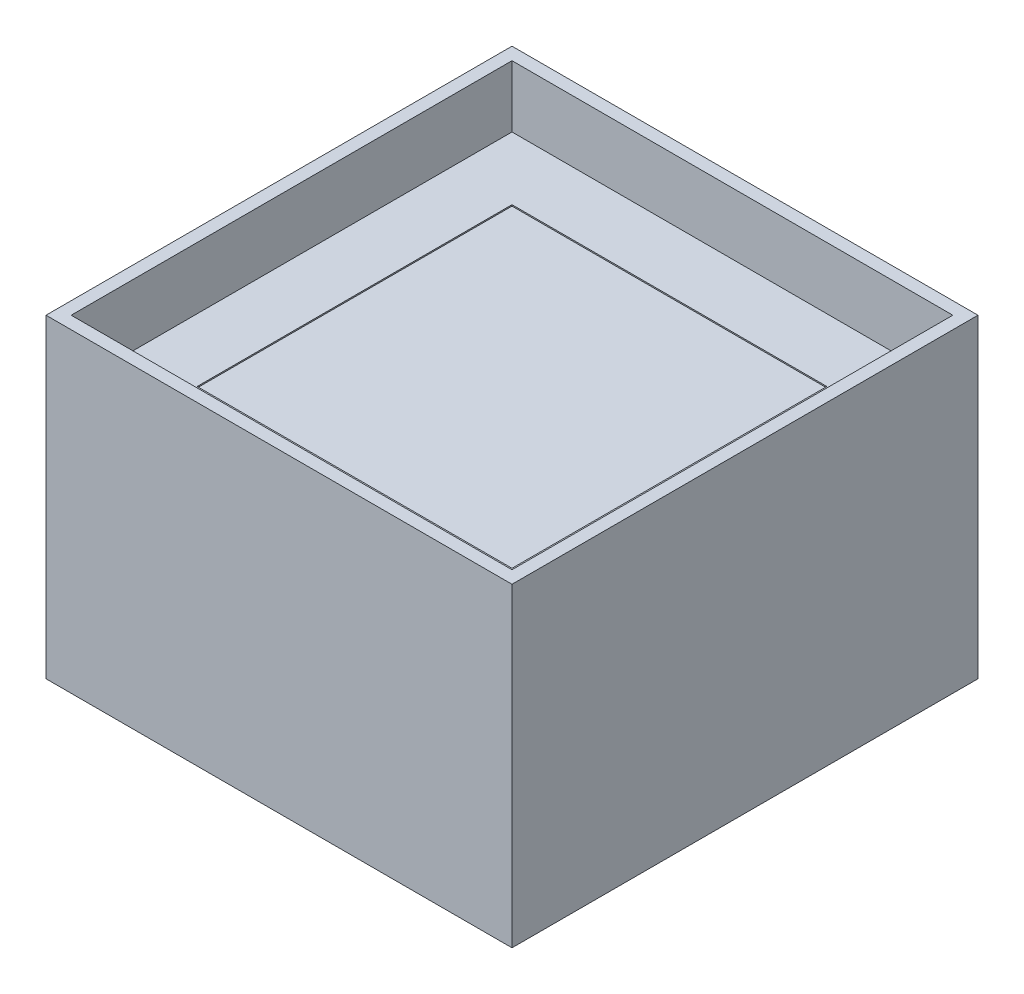
ISO-10303-21;
HEADER;
FILE_DESCRIPTION(('STEP AP214'),'2;1');
FILE_NAME('part.step','',(''),(''),'','','');
FILE_SCHEMA(('AUTOMOTIVE_DESIGN { 1 0 10303 214 1 1 1 1 }'));
ENDSEC;
DATA;
#1=APPLICATION_CONTEXT('core data for automotive mechanical design processes');
#2=APPLICATION_PROTOCOL_DEFINITION('international standard','automotive_design',2000,#1);
#3=PRODUCT_CONTEXT('',#1,'mechanical');
#4=PRODUCT('Part','Part','',(#3));
#5=PRODUCT_RELATED_PRODUCT_CATEGORY('part','',(#4));
#6=PRODUCT_DEFINITION_FORMATION('','',#4);
#7=PRODUCT_DEFINITION_CONTEXT('part definition',#1,'design');
#8=PRODUCT_DEFINITION('design','',#6,#7);
#9=PRODUCT_DEFINITION_SHAPE('','',#8);
#10=(LENGTH_UNIT() NAMED_UNIT(*) SI_UNIT(.MILLI.,.METRE.));
#11=(NAMED_UNIT(*) PLANE_ANGLE_UNIT() SI_UNIT($,.RADIAN.));
#12=(NAMED_UNIT(*) SI_UNIT($,.STERADIAN.) SOLID_ANGLE_UNIT());
#13=UNCERTAINTY_MEASURE_WITH_UNIT(LENGTH_MEASURE(1.E-05),#10,'distance_accuracy_value','');
#14=(GEOMETRIC_REPRESENTATION_CONTEXT(3) GLOBAL_UNCERTAINTY_ASSIGNED_CONTEXT((#13)) GLOBAL_UNIT_ASSIGNED_CONTEXT((#10,
#11,#12)) REPRESENTATION_CONTEXT('',''));
#15=CARTESIAN_POINT('',(0.,0.,0.));
#16=DIRECTION('',(0.,0.,1.));
#17=DIRECTION('',(1.,0.,0.));
#18=AXIS2_PLACEMENT_3D('',#15,#16,#17);
#19=CARTESIAN_POINT('',(0.,50.,0.));
#20=DIRECTION('',(0.,1.,0.));
#21=DIRECTION('',(0.,0.,1.));
#22=AXIS2_PLACEMENT_3D('',#19,#20,#21);
#23=PLANE('',#22);
#24=DIRECTION('',(0.,0.,-1.));
#25=VECTOR('',#24,1.);
#26=CARTESIAN_POINT('',(185.,50.,-185.));
#27=LINE('',#26,#25);
#28=CARTESIAN_POINT('',(185.,50.,185.));
#29=VERTEX_POINT('',#28);
#30=CARTESIAN_POINT('',(185.,50.,-185.));
#31=VERTEX_POINT('',#30);
#32=EDGE_CURVE('E238',#29,#31,#27,.T.);
#33=ORIENTED_EDGE('',*,*,#32,.T.);
#34=DIRECTION('',(-1.,0.,0.));
#35=VECTOR('',#34,1.);
#36=CARTESIAN_POINT('',(-185.,50.,-185.));
#37=LINE('',#36,#35);
#38=CARTESIAN_POINT('',(-185.,50.,-185.));
#39=VERTEX_POINT('',#38);
#40=EDGE_CURVE('E242',#31,#39,#37,.T.);
#41=ORIENTED_EDGE('',*,*,#40,.T.);
#42=DIRECTION('',(0.,0.,1.));
#43=VECTOR('',#42,1.);
#44=CARTESIAN_POINT('',(-185.,50.,-185.));
#45=LINE('',#44,#43);
#46=CARTESIAN_POINT('',(-185.,50.,185.));
#47=VERTEX_POINT('',#46);
#48=EDGE_CURVE('E245',#39,#47,#45,.T.);
#49=ORIENTED_EDGE('',*,*,#48,.T.);
#50=DIRECTION('',(1.,0.,0.));
#51=VECTOR('',#50,1.);
#52=CARTESIAN_POINT('',(-185.,50.,185.));
#53=LINE('',#52,#51);
#54=EDGE_CURVE('E248',#47,#29,#53,.T.);
#55=ORIENTED_EDGE('',*,*,#54,.T.);
#56=EDGE_LOOP('',(#33,#41,#49,#55));
#57=FACE_BOUND('',#56,.T.);
#58=DIRECTION('',(-1.,0.,0.));
#59=VECTOR('',#58,1.);
#60=CARTESIAN_POINT('',(-175.,50.,-175.));
#61=LINE('',#60,#59);
#62=CARTESIAN_POINT('',(175.,50.,-175.));
#63=VERTEX_POINT('',#62);
#64=CARTESIAN_POINT('',(-175.,50.,-175.));
#65=VERTEX_POINT('',#64);
#66=EDGE_CURVE('E216',#63,#65,#61,.T.);
#67=ORIENTED_EDGE('',*,*,#66,.F.);
#68=DIRECTION('',(0.,0.,-1.));
#69=VECTOR('',#68,1.);
#70=CARTESIAN_POINT('',(175.,50.,-175.));
#71=LINE('',#70,#69);
#72=CARTESIAN_POINT('',(175.,50.,175.));
#73=VERTEX_POINT('',#72);
#74=EDGE_CURVE('E213',#73,#63,#71,.T.);
#75=ORIENTED_EDGE('',*,*,#74,.F.);
#76=DIRECTION('',(1.,0.,0.));
#77=VECTOR('',#76,1.);
#78=CARTESIAN_POINT('',(-175.,50.,175.));
#79=LINE('',#78,#77);
#80=CARTESIAN_POINT('',(-175.,50.,175.));
#81=VERTEX_POINT('',#80);
#82=EDGE_CURVE('E223',#81,#73,#79,.T.);
#83=ORIENTED_EDGE('',*,*,#82,.F.);
#84=DIRECTION('',(0.,0.,1.));
#85=VECTOR('',#84,1.);
#86=CARTESIAN_POINT('',(-175.,50.,-175.));
#87=LINE('',#86,#85);
#88=EDGE_CURVE('E219',#65,#81,#87,.T.);
#89=ORIENTED_EDGE('',*,*,#88,.F.);
#90=EDGE_LOOP('',(#67,#75,#83,#89));
#91=FACE_BOUND('',#90,.T.);
#92=ADVANCED_FACE('F39',(#57,#91),#23,.T.);
#93=CARTESIAN_POINT('',(185.,50.,-185.));
#94=DIRECTION('',(-1.,0.,0.));
#95=DIRECTION('',(0.,0.,1.));
#96=AXIS2_PLACEMENT_3D('',#93,#94,#95);
#97=PLANE('',#96);
#98=DIRECTION('',(0.,-1.,0.));
#99=VECTOR('',#98,1.);
#100=CARTESIAN_POINT('',(185.,50.,185.));
#101=LINE('',#100,#99);
#102=CARTESIAN_POINT('',(185.,-200.,185.));
#103=VERTEX_POINT('',#102);
#104=EDGE_CURVE('E251',#29,#103,#101,.T.);
#105=ORIENTED_EDGE('',*,*,#104,.T.);
#106=DIRECTION('',(0.,0.,1.));
#107=VECTOR('',#106,1.);
#108=CARTESIAN_POINT('',(185.,-200.,185.));
#109=LINE('',#108,#107);
#110=CARTESIAN_POINT('',(185.,-200.,-185.));
#111=VERTEX_POINT('',#110);
#112=EDGE_CURVE('E205',#111,#103,#109,.T.);
#113=ORIENTED_EDGE('',*,*,#112,.F.);
#114=DIRECTION('',(0.,-1.,0.));
#115=VECTOR('',#114,1.);
#116=CARTESIAN_POINT('',(185.,50.,-185.));
#117=LINE('',#116,#115);
#118=EDGE_CURVE('E11',#31,#111,#117,.T.);
#119=ORIENTED_EDGE('',*,*,#118,.F.);
#120=ORIENTED_EDGE('',*,*,#32,.F.);
#121=EDGE_LOOP('',(#105,#113,#119,#120));
#122=FACE_BOUND('',#121,.T.);
#123=ADVANCED_FACE('F41',(#122),#97,.F.);
#124=CARTESIAN_POINT('',(-185.,50.,-185.));
#125=DIRECTION('',(0.,0.,1.));
#126=DIRECTION('',(1.,0.,0.));
#127=AXIS2_PLACEMENT_3D('',#124,#125,#126);
#128=PLANE('',#127);
#129=ORIENTED_EDGE('',*,*,#118,.T.);
#130=DIRECTION('',(1.,0.,0.));
#131=VECTOR('',#130,1.);
#132=CARTESIAN_POINT('',(-185.,-200.,-185.));
#133=LINE('',#132,#131);
#134=CARTESIAN_POINT('',(-185.,-200.,-185.));
#135=VERTEX_POINT('',#134);
#136=EDGE_CURVE('E201',#135,#111,#133,.T.);
#137=ORIENTED_EDGE('',*,*,#136,.F.);
#138=DIRECTION('',(0.,-1.,0.));
#139=VECTOR('',#138,1.);
#140=CARTESIAN_POINT('',(-185.,50.,-185.));
#141=LINE('',#140,#139);
#142=EDGE_CURVE('E48',#39,#135,#141,.T.);
#143=ORIENTED_EDGE('',*,*,#142,.F.);
#144=ORIENTED_EDGE('',*,*,#40,.F.);
#145=EDGE_LOOP('',(#129,#137,#143,#144));
#146=FACE_BOUND('',#145,.T.);
#147=ADVANCED_FACE('F265',(#146),#128,.F.);
#148=CARTESIAN_POINT('',(-185.,50.,-185.));
#149=DIRECTION('',(1.,0.,0.));
#150=DIRECTION('',(0.,0.,-1.));
#151=AXIS2_PLACEMENT_3D('',#148,#149,#150);
#152=PLANE('',#151);
#153=ORIENTED_EDGE('',*,*,#142,.T.);
#154=DIRECTION('',(0.,0.,-1.));
#155=VECTOR('',#154,1.);
#156=CARTESIAN_POINT('',(-185.,-200.,185.));
#157=LINE('',#156,#155);
#158=CARTESIAN_POINT('',(-185.,-200.,185.));
#159=VERTEX_POINT('',#158);
#160=EDGE_CURVE('E197',#159,#135,#157,.T.);
#161=ORIENTED_EDGE('',*,*,#160,.F.);
#162=DIRECTION('',(0.,-1.,0.));
#163=VECTOR('',#162,1.);
#164=CARTESIAN_POINT('',(-185.,50.,185.));
#165=LINE('',#164,#163);
#166=EDGE_CURVE('E254',#47,#159,#165,.T.);
#167=ORIENTED_EDGE('',*,*,#166,.F.);
#168=ORIENTED_EDGE('',*,*,#48,.F.);
#169=EDGE_LOOP('',(#153,#161,#167,#168));
#170=FACE_BOUND('',#169,.T.);
#171=ADVANCED_FACE('F262',(#170),#152,.F.);
#172=CARTESIAN_POINT('',(-185.,50.,185.));
#173=DIRECTION('',(0.,0.,-1.));
#174=DIRECTION('',(-1.,0.,0.));
#175=AXIS2_PLACEMENT_3D('',#172,#173,#174);
#176=PLANE('',#175);
#177=ORIENTED_EDGE('',*,*,#166,.T.);
#178=DIRECTION('',(-1.,0.,0.));
#179=VECTOR('',#178,1.);
#180=CARTESIAN_POINT('',(-185.,-200.,185.));
#181=LINE('',#180,#179);
#182=EDGE_CURVE('E209',#103,#159,#181,.T.);
#183=ORIENTED_EDGE('',*,*,#182,.F.);
#184=ORIENTED_EDGE('',*,*,#104,.F.);
#185=ORIENTED_EDGE('',*,*,#54,.F.);
#186=EDGE_LOOP('',(#177,#183,#184,#185));
#187=FACE_BOUND('',#186,.T.);
#188=ADVANCED_FACE('F273',(#187),#176,.F.);
#189=CARTESIAN_POINT('',(175.,50.,-175.));
#190=DIRECTION('',(-1.,0.,0.));
#191=DIRECTION('',(0.,0.,1.));
#192=AXIS2_PLACEMENT_3D('',#189,#190,#191);
#193=PLANE('',#192);
#194=DIRECTION('',(0.,0.,-1.));
#195=VECTOR('',#194,1.);
#196=CARTESIAN_POINT('',(175.,1.,-175.));
#197=LINE('',#196,#195);
#198=CARTESIAN_POINT('',(175.,1.,175.));
#199=VERTEX_POINT('',#198);
#200=CARTESIAN_POINT('',(175.,1.,-175.));
#201=VERTEX_POINT('',#200);
#202=EDGE_CURVE('E191',#199,#201,#197,.T.);
#203=ORIENTED_EDGE('',*,*,#202,.F.);
#204=DIRECTION('',(0.,-1.,0.));
#205=VECTOR('',#204,1.);
#206=CARTESIAN_POINT('',(175.,50.,175.));
#207=LINE('',#206,#205);
#208=EDGE_CURVE('E226',#73,#199,#207,.T.);
#209=ORIENTED_EDGE('',*,*,#208,.F.);
#210=ORIENTED_EDGE('',*,*,#74,.T.);
#211=DIRECTION('',(0.,-1.,0.));
#212=VECTOR('',#211,1.);
#213=CARTESIAN_POINT('',(175.,50.,-175.));
#214=LINE('',#213,#212);
#215=EDGE_CURVE('E235',#63,#201,#214,.T.);
#216=ORIENTED_EDGE('',*,*,#215,.T.);
#217=EDGE_LOOP('',(#203,#209,#210,#216));
#218=FACE_BOUND('',#217,.T.);
#219=ADVANCED_FACE('F289',(#218),#193,.T.);
#220=CARTESIAN_POINT('',(-175.,50.,-175.));
#221=DIRECTION('',(0.,0.,1.));
#222=DIRECTION('',(1.,0.,0.));
#223=AXIS2_PLACEMENT_3D('',#220,#221,#222);
#224=PLANE('',#223);
#225=DIRECTION('',(-1.,0.,0.));
#226=VECTOR('',#225,1.);
#227=CARTESIAN_POINT('',(-175.,1.,-175.));
#228=LINE('',#227,#226);
#229=CARTESIAN_POINT('',(-175.,1.,-175.));
#230=VERTEX_POINT('',#229);
#231=EDGE_CURVE('E55',#201,#230,#228,.T.);
#232=ORIENTED_EDGE('',*,*,#231,.F.);
#233=ORIENTED_EDGE('',*,*,#215,.F.);
#234=ORIENTED_EDGE('',*,*,#66,.T.);
#235=DIRECTION('',(0.,-1.,0.));
#236=VECTOR('',#235,1.);
#237=CARTESIAN_POINT('',(-175.,50.,-175.));
#238=LINE('',#237,#236);
#239=EDGE_CURVE('E232',#65,#230,#238,.T.);
#240=ORIENTED_EDGE('',*,*,#239,.T.);
#241=EDGE_LOOP('',(#232,#233,#234,#240));
#242=FACE_BOUND('',#241,.T.);
#243=ADVANCED_FACE('F310',(#242),#224,.T.);
#244=CARTESIAN_POINT('',(-175.,50.,-175.));
#245=DIRECTION('',(1.,0.,0.));
#246=DIRECTION('',(0.,0.,-1.));
#247=AXIS2_PLACEMENT_3D('',#244,#245,#246);
#248=PLANE('',#247);
#249=DIRECTION('',(0.,0.,1.));
#250=VECTOR('',#249,1.);
#251=CARTESIAN_POINT('',(-175.,1.,-175.));
#252=LINE('',#251,#250);
#253=CARTESIAN_POINT('',(-175.,1.,175.));
#254=VERTEX_POINT('',#253);
#255=EDGE_CURVE('E63',#230,#254,#252,.T.);
#256=ORIENTED_EDGE('',*,*,#255,.F.);
#257=ORIENTED_EDGE('',*,*,#239,.F.);
#258=ORIENTED_EDGE('',*,*,#88,.T.);
#259=DIRECTION('',(0.,-1.,0.));
#260=VECTOR('',#259,1.);
#261=CARTESIAN_POINT('',(-175.,50.,175.));
#262=LINE('',#261,#260);
#263=EDGE_CURVE('E229',#81,#254,#262,.T.);
#264=ORIENTED_EDGE('',*,*,#263,.T.);
#265=EDGE_LOOP('',(#256,#257,#258,#264));
#266=FACE_BOUND('',#265,.T.);
#267=ADVANCED_FACE('F320',(#266),#248,.T.);
#268=CARTESIAN_POINT('',(-175.,50.,175.));
#269=DIRECTION('',(0.,0.,-1.));
#270=DIRECTION('',(-1.,0.,0.));
#271=AXIS2_PLACEMENT_3D('',#268,#269,#270);
#272=PLANE('',#271);
#273=DIRECTION('',(1.,0.,0.));
#274=VECTOR('',#273,1.);
#275=CARTESIAN_POINT('',(-175.,1.,175.));
#276=LINE('',#275,#274);
#277=EDGE_CURVE('E187',#254,#199,#276,.T.);
#278=ORIENTED_EDGE('',*,*,#277,.F.);
#279=ORIENTED_EDGE('',*,*,#263,.F.);
#280=ORIENTED_EDGE('',*,*,#82,.T.);
#281=ORIENTED_EDGE('',*,*,#208,.T.);
#282=EDGE_LOOP('',(#278,#279,#280,#281));
#283=FACE_BOUND('',#282,.T.);
#284=ADVANCED_FACE('F328',(#283),#272,.T.);
#285=CARTESIAN_POINT('',(0.,-200.,0.));
#286=DIRECTION('',(0.,-1.,0.));
#287=DIRECTION('',(0.,0.,-1.));
#288=AXIS2_PLACEMENT_3D('',#285,#286,#287);
#289=PLANE('',#288);
#290=ORIENTED_EDGE('',*,*,#160,.T.);
#291=ORIENTED_EDGE('',*,*,#136,.T.);
#292=ORIENTED_EDGE('',*,*,#112,.T.);
#293=ORIENTED_EDGE('',*,*,#182,.T.);
#294=EDGE_LOOP('',(#290,#291,#292,#293));
#295=FACE_BOUND('',#294,.T.);
#296=ADVANCED_FACE('F269',(#295),#289,.T.);
#297=CARTESIAN_POINT('',(0.,1.,0.));
#298=DIRECTION('',(0.,1.,0.));
#299=DIRECTION('',(0.,0.,1.));
#300=AXIS2_PLACEMENT_3D('',#297,#298,#299);
#301=PLANE('',#300);
#302=ORIENTED_EDGE('',*,*,#255,.T.);
#303=ORIENTED_EDGE('',*,*,#277,.T.);
#304=ORIENTED_EDGE('',*,*,#202,.T.);
#305=ORIENTED_EDGE('',*,*,#231,.T.);
#306=EDGE_LOOP('',(#302,#303,#304,#305));
#307=FACE_BOUND('',#306,.T.);
#308=DIRECTION('',(-1.,0.,0.));
#309=VECTOR('',#308,1.);
#310=CARTESIAN_POINT('',(-125.,1.,-125.));
#311=LINE('',#310,#309);
#312=CARTESIAN_POINT('',(125.,1.,-125.));
#313=VERTEX_POINT('',#312);
#314=CARTESIAN_POINT('',(-125.,1.,-125.));
#315=VERTEX_POINT('',#314);
#316=EDGE_CURVE('E143',#313,#315,#311,.T.);
#317=ORIENTED_EDGE('',*,*,#316,.F.);
#318=DIRECTION('',(0.,0.,-1.));
#319=VECTOR('',#318,1.);
#320=CARTESIAN_POINT('',(125.,1.,-125.));
#321=LINE('',#320,#319);
#322=CARTESIAN_POINT('',(125.,1.,125.));
#323=VERTEX_POINT('',#322);
#324=EDGE_CURVE('E132',#323,#313,#321,.T.);
#325=ORIENTED_EDGE('',*,*,#324,.F.);
#326=DIRECTION('',(1.,0.,0.));
#327=VECTOR('',#326,1.);
#328=CARTESIAN_POINT('',(-125.,1.,125.));
#329=LINE('',#328,#327);
#330=CARTESIAN_POINT('',(-125.,1.,125.));
#331=VERTEX_POINT('',#330);
#332=EDGE_CURVE('E161',#331,#323,#329,.T.);
#333=ORIENTED_EDGE('',*,*,#332,.F.);
#334=DIRECTION('',(0.,0.,1.));
#335=VECTOR('',#334,1.);
#336=CARTESIAN_POINT('',(-125.,1.,-125.));
#337=LINE('',#336,#335);
#338=EDGE_CURVE('E157',#315,#331,#337,.T.);
#339=ORIENTED_EDGE('',*,*,#338,.F.);
#340=EDGE_LOOP('',(#317,#325,#333,#339));
#341=FACE_BOUND('',#340,.T.);
#342=ADVANCED_FACE('F155',(#307,#341),#301,.T.);
#343=CARTESIAN_POINT('',(125.,1.,-125.));
#344=DIRECTION('',(-1.,0.,0.));
#345=DIRECTION('',(0.,0.,1.));
#346=AXIS2_PLACEMENT_3D('',#343,#344,#345);
#347=PLANE('',#346);
#348=DIRECTION('',(0.,0.,-1.));
#349=VECTOR('',#348,1.);
#350=CARTESIAN_POINT('',(125.,0.,-125.));
#351=LINE('',#350,#349);
#352=CARTESIAN_POINT('',(125.,0.,125.));
#353=VERTEX_POINT('',#352);
#354=CARTESIAN_POINT('',(125.,0.,-125.));
#355=VERTEX_POINT('',#354);
#356=EDGE_CURVE('E166',#353,#355,#351,.T.);
#357=ORIENTED_EDGE('',*,*,#356,.F.);
#358=DIRECTION('',(0.,-1.,0.));
#359=VECTOR('',#358,1.);
#360=CARTESIAN_POINT('',(125.,1.,125.));
#361=LINE('',#360,#359);
#362=EDGE_CURVE('E138',#323,#353,#361,.T.);
#363=ORIENTED_EDGE('',*,*,#362,.F.);
#364=ORIENTED_EDGE('',*,*,#324,.T.);
#365=DIRECTION('',(0.,-1.,0.));
#366=VECTOR('',#365,1.);
#367=CARTESIAN_POINT('',(125.,1.,-125.));
#368=LINE('',#367,#366);
#369=EDGE_CURVE('E136',#313,#355,#368,.T.);
#370=ORIENTED_EDGE('',*,*,#369,.T.);
#371=EDGE_LOOP('',(#357,#363,#364,#370));
#372=FACE_BOUND('',#371,.T.);
#373=ADVANCED_FACE('F135',(#372),#347,.T.);
#374=CARTESIAN_POINT('',(-125.,1.,-125.));
#375=DIRECTION('',(0.,0.,1.));
#376=DIRECTION('',(1.,0.,0.));
#377=AXIS2_PLACEMENT_3D('',#374,#375,#376);
#378=PLANE('',#377);
#379=DIRECTION('',(-1.,0.,0.));
#380=VECTOR('',#379,1.);
#381=CARTESIAN_POINT('',(-125.,0.,-125.));
#382=LINE('',#381,#380);
#383=CARTESIAN_POINT('',(-125.,0.,-125.));
#384=VERTEX_POINT('',#383);
#385=EDGE_CURVE('E150',#355,#384,#382,.T.);
#386=ORIENTED_EDGE('',*,*,#385,.F.);
#387=ORIENTED_EDGE('',*,*,#369,.F.);
#388=ORIENTED_EDGE('',*,*,#316,.T.);
#389=DIRECTION('',(0.,-1.,0.));
#390=VECTOR('',#389,1.);
#391=CARTESIAN_POINT('',(-125.,1.,-125.));
#392=LINE('',#391,#390);
#393=EDGE_CURVE('E152',#315,#384,#392,.T.);
#394=ORIENTED_EDGE('',*,*,#393,.T.);
#395=EDGE_LOOP('',(#386,#387,#388,#394));
#396=FACE_BOUND('',#395,.T.);
#397=ADVANCED_FACE('F147',(#396),#378,.T.);
#398=CARTESIAN_POINT('',(-125.,1.,-125.));
#399=DIRECTION('',(1.,0.,0.));
#400=DIRECTION('',(0.,0.,-1.));
#401=AXIS2_PLACEMENT_3D('',#398,#399,#400);
#402=PLANE('',#401);
#403=DIRECTION('',(0.,0.,1.));
#404=VECTOR('',#403,1.);
#405=CARTESIAN_POINT('',(-125.,0.,-125.));
#406=LINE('',#405,#404);
#407=CARTESIAN_POINT('',(-125.,0.,125.));
#408=VERTEX_POINT('',#407);
#409=EDGE_CURVE('E171',#384,#408,#406,.T.);
#410=ORIENTED_EDGE('',*,*,#409,.F.);
#411=ORIENTED_EDGE('',*,*,#393,.F.);
#412=ORIENTED_EDGE('',*,*,#338,.T.);
#413=DIRECTION('',(0.,-1.,0.));
#414=VECTOR('',#413,1.);
#415=CARTESIAN_POINT('',(-125.,1.,125.));
#416=LINE('',#415,#414);
#417=EDGE_CURVE('E180',#331,#408,#416,.T.);
#418=ORIENTED_EDGE('',*,*,#417,.T.);
#419=EDGE_LOOP('',(#410,#411,#412,#418));
#420=FACE_BOUND('',#419,.T.);
#421=ADVANCED_FACE('F376',(#420),#402,.T.);
#422=CARTESIAN_POINT('',(-125.,1.,125.));
#423=DIRECTION('',(0.,0.,-1.));
#424=DIRECTION('',(-1.,0.,0.));
#425=AXIS2_PLACEMENT_3D('',#422,#423,#424);
#426=PLANE('',#425);
#427=DIRECTION('',(1.,0.,0.));
#428=VECTOR('',#427,1.);
#429=CARTESIAN_POINT('',(-125.,0.,125.));
#430=LINE('',#429,#428);
#431=EDGE_CURVE('E144',#408,#353,#430,.T.);
#432=ORIENTED_EDGE('',*,*,#431,.F.);
#433=ORIENTED_EDGE('',*,*,#417,.F.);
#434=ORIENTED_EDGE('',*,*,#332,.T.);
#435=ORIENTED_EDGE('',*,*,#362,.T.);
#436=EDGE_LOOP('',(#432,#433,#434,#435));
#437=FACE_BOUND('',#436,.T.);
#438=ADVANCED_FACE('F349',(#437),#426,.T.);
#439=CARTESIAN_POINT('',(0.,0.,0.));
#440=DIRECTION('',(0.,-1.,0.));
#441=DIRECTION('',(0.,0.,-1.));
#442=AXIS2_PLACEMENT_3D('',#439,#440,#441);
#443=PLANE('',#442);
#444=ORIENTED_EDGE('',*,*,#431,.T.);
#445=ORIENTED_EDGE('',*,*,#356,.T.);
#446=ORIENTED_EDGE('',*,*,#385,.T.);
#447=ORIENTED_EDGE('',*,*,#409,.T.);
#448=EDGE_LOOP('',(#444,#445,#446,#447));
#449=FACE_BOUND('',#448,.T.);
#450=ADVANCED_FACE('F344',(#449),#443,.F.);
#451=CLOSED_SHELL('',(#92,#123,#147,#171,#188,#219,#243,#267,#284,#296,#342,#373,#397,#421,#438,#450));
#452=MANIFOLD_SOLID_BREP('B2',#451);
#453=ADVANCED_BREP_SHAPE_REPRESENTATION('',(#18,#452),#14);
#454=SHAPE_DEFINITION_REPRESENTATION(#9,#453);
ENDSEC;
END-ISO-10303-21;
